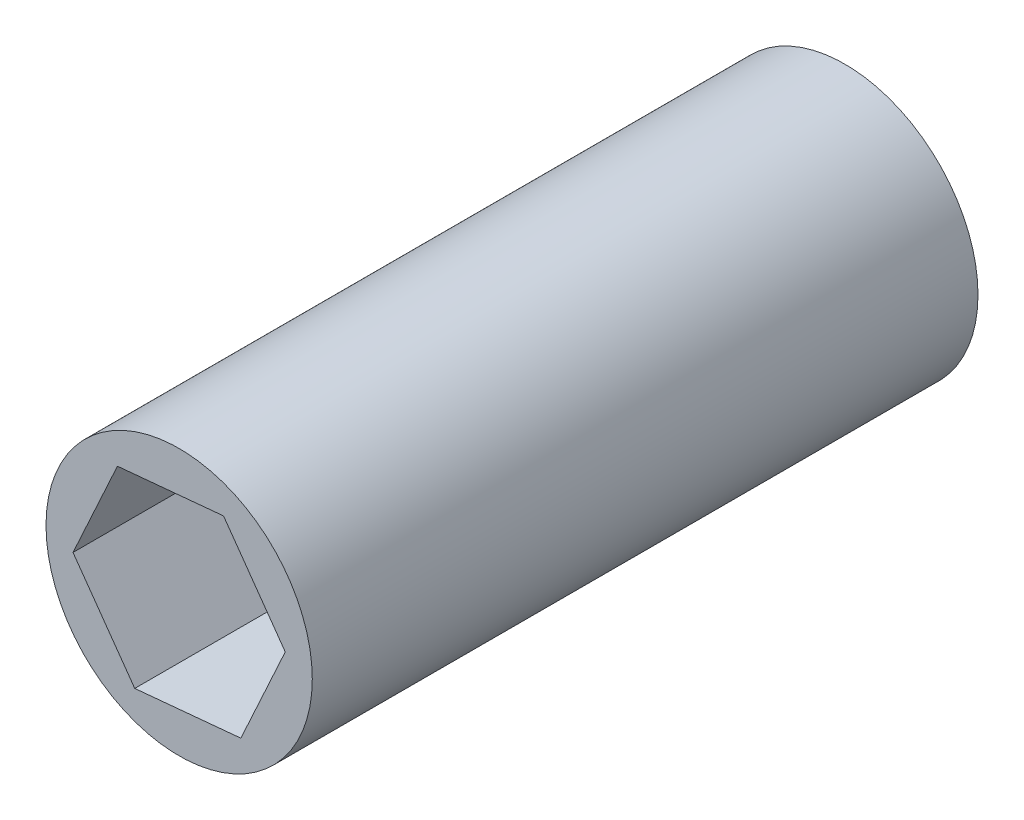
ISO-10303-21;
HEADER;
FILE_DESCRIPTION(('STEP AP214'),'2;1');
FILE_NAME('part.step','',(''),(''),'','','');
FILE_SCHEMA(('AUTOMOTIVE_DESIGN { 1 0 10303 214 1 1 1 1 }'));
ENDSEC;
DATA;
#1=APPLICATION_CONTEXT('core data for automotive mechanical design processes');
#2=APPLICATION_PROTOCOL_DEFINITION('international standard','automotive_design',2000,#1);
#3=PRODUCT_CONTEXT('',#1,'mechanical');
#4=PRODUCT('Part','Part','',(#3));
#5=PRODUCT_RELATED_PRODUCT_CATEGORY('part','',(#4));
#6=PRODUCT_DEFINITION_FORMATION('','',#4);
#7=PRODUCT_DEFINITION_CONTEXT('part definition',#1,'design');
#8=PRODUCT_DEFINITION('design','',#6,#7);
#9=PRODUCT_DEFINITION_SHAPE('','',#8);
#10=(LENGTH_UNIT() NAMED_UNIT(*) SI_UNIT(.MILLI.,.METRE.));
#11=(NAMED_UNIT(*) PLANE_ANGLE_UNIT() SI_UNIT($,.RADIAN.));
#12=(NAMED_UNIT(*) SI_UNIT($,.STERADIAN.) SOLID_ANGLE_UNIT());
#13=UNCERTAINTY_MEASURE_WITH_UNIT(LENGTH_MEASURE(1.E-05),#10,'distance_accuracy_value','');
#14=(GEOMETRIC_REPRESENTATION_CONTEXT(3) GLOBAL_UNCERTAINTY_ASSIGNED_CONTEXT((#13)) GLOBAL_UNIT_ASSIGNED_CONTEXT((#10,
#11,#12)) REPRESENTATION_CONTEXT('',''));
#15=CARTESIAN_POINT('',(0.,0.,0.));
#16=DIRECTION('',(0.,0.,1.));
#17=DIRECTION('',(1.,0.,0.));
#18=AXIS2_PLACEMENT_3D('',#15,#16,#17);
#19=CARTESIAN_POINT('',(0.,0.,47.625));
#20=DIRECTION('',(0.,0.,1.));
#21=DIRECTION('',(1.,0.,0.));
#22=AXIS2_PLACEMENT_3D('',#19,#20,#21);
#23=PLANE('',#22);
#24=CARTESIAN_POINT('',(0.,0.,47.625));
#25=DIRECTION('',(0.,0.,1.));
#26=DIRECTION('',(1.,0.,0.));
#27=AXIS2_PLACEMENT_3D('',#24,#25,#26);
#28=CIRCLE('',#27,9.525);
#29=CARTESIAN_POINT('',(9.525,0.,47.625));
#30=VERTEX_POINT('',#29);
#31=EDGE_CURVE('E11',#30,#30,#28,.T.);
#32=ORIENTED_EDGE('',*,*,#31,.T.);
#33=EDGE_LOOP('',(#32));
#34=FACE_BOUND('',#33,.T.);
#35=DIRECTION('',(-0.416593831263026,-0.90909272340812,0.));
#36=VECTOR('',#35,1.);
#37=CARTESIAN_POINT('',(-4.41525056303659,6.2173936499902,47.625));
#38=LINE('',#37,#36);
#39=CARTESIAN_POINT('',(-4.41525056303659,6.2173936499902,47.625));
#40=VERTEX_POINT('',#39);
#41=CARTESIAN_POINT('',(-7.59204612773786,-0.715022326668139,47.625));
#42=VERTEX_POINT('',#41);
#43=EDGE_CURVE('E94',#40,#42,#38,.T.);
#44=ORIENTED_EDGE('',*,*,#43,.F.);
#45=DIRECTION('',(-0.995594308498526,-0.0937655207703908,0.));
#46=VECTOR('',#45,1.);
#47=CARTESIAN_POINT('',(3.17679556470127,6.93241597665833,47.625));
#48=LINE('',#47,#46);
#49=CARTESIAN_POINT('',(3.17679556470127,6.93241597665833,47.625));
#50=VERTEX_POINT('',#49);
#51=EDGE_CURVE('E86',#50,#40,#48,.T.);
#52=ORIENTED_EDGE('',*,*,#51,.F.);
#53=DIRECTION('',(-0.579000477235499,0.815327202637729,0.));
#54=VECTOR('',#53,1.);
#55=CARTESIAN_POINT('',(7.59204612773786,0.715022326668137,47.625));
#56=LINE('',#55,#54);
#57=CARTESIAN_POINT('',(7.59204612773786,0.715022326668137,47.625));
#58=VERTEX_POINT('',#57);
#59=EDGE_CURVE('E114',#58,#50,#56,.T.);
#60=ORIENTED_EDGE('',*,*,#59,.F.);
#61=DIRECTION('',(0.416593831263027,0.90909272340812,0.));
#62=VECTOR('',#61,1.);
#63=CARTESIAN_POINT('',(4.41525056303659,-6.2173936499902,47.625));
#64=LINE('',#63,#62);
#65=CARTESIAN_POINT('',(4.41525056303659,-6.2173936499902,47.625));
#66=VERTEX_POINT('',#65);
#67=EDGE_CURVE('E112',#66,#58,#64,.T.);
#68=ORIENTED_EDGE('',*,*,#67,.F.);
#69=DIRECTION('',(0.995594308498526,0.0937655207703907,0.));
#70=VECTOR('',#69,1.);
#71=CARTESIAN_POINT('',(-3.17679556470126,-6.93241597665833,47.625));
#72=LINE('',#71,#70);
#73=CARTESIAN_POINT('',(-3.17679556470126,-6.93241597665833,47.625));
#74=VERTEX_POINT('',#73);
#75=EDGE_CURVE('E108',#74,#66,#72,.T.);
#76=ORIENTED_EDGE('',*,*,#75,.F.);
#77=DIRECTION('',(0.579000477235499,-0.815327202637729,0.));
#78=VECTOR('',#77,1.);
#79=CARTESIAN_POINT('',(-7.59204612773786,-0.715022326668139,47.625));
#80=LINE('',#79,#78);
#81=EDGE_CURVE('E106',#42,#74,#80,.T.);
#82=ORIENTED_EDGE('',*,*,#81,.F.);
#83=EDGE_LOOP('',(#44,#52,#60,#68,#76,#82));
#84=FACE_BOUND('',#83,.T.);
#85=ADVANCED_FACE('F33',(#34,#84),#23,.T.);
#86=CARTESIAN_POINT('',(0.,0.,0.));
#87=DIRECTION('',(0.,0.,1.));
#88=DIRECTION('',(1.,0.,0.));
#89=AXIS2_PLACEMENT_3D('',#86,#87,#88);
#90=PLANE('',#89);
#91=CARTESIAN_POINT('',(0.,0.,0.));
#92=DIRECTION('',(0.,0.,1.));
#93=DIRECTION('',(1.,0.,0.));
#94=AXIS2_PLACEMENT_3D('',#91,#92,#93);
#95=CIRCLE('',#94,9.525);
#96=CARTESIAN_POINT('',(9.525,0.,0.));
#97=VERTEX_POINT('',#96);
#98=EDGE_CURVE('E37',#97,#97,#95,.T.);
#99=ORIENTED_EDGE('',*,*,#98,.F.);
#100=EDGE_LOOP('',(#99));
#101=FACE_BOUND('',#100,.T.);
#102=DIRECTION('',(-0.995594308498526,-0.0937655207703908,0.));
#103=VECTOR('',#102,1.);
#104=CARTESIAN_POINT('',(3.17679556470127,6.93241597665833,0.));
#105=LINE('',#104,#103);
#106=CARTESIAN_POINT('',(3.17679556470127,6.93241597665833,0.));
#107=VERTEX_POINT('',#106);
#108=CARTESIAN_POINT('',(-4.41525056303659,6.2173936499902,0.));
#109=VERTEX_POINT('',#108);
#110=EDGE_CURVE('E56',#107,#109,#105,.T.);
#111=ORIENTED_EDGE('',*,*,#110,.T.);
#112=DIRECTION('',(-0.416593831263026,-0.90909272340812,0.));
#113=VECTOR('',#112,1.);
#114=CARTESIAN_POINT('',(-4.41525056303659,6.2173936499902,0.));
#115=LINE('',#114,#113);
#116=CARTESIAN_POINT('',(-7.59204612773786,-0.715022326668139,0.));
#117=VERTEX_POINT('',#116);
#118=EDGE_CURVE('E101',#109,#117,#115,.T.);
#119=ORIENTED_EDGE('',*,*,#118,.T.);
#120=DIRECTION('',(0.579000477235499,-0.815327202637729,0.));
#121=VECTOR('',#120,1.);
#122=CARTESIAN_POINT('',(-7.59204612773786,-0.715022326668139,0.));
#123=LINE('',#122,#121);
#124=CARTESIAN_POINT('',(-3.17679556470126,-6.93241597665833,0.));
#125=VERTEX_POINT('',#124);
#126=EDGE_CURVE('E118',#117,#125,#123,.T.);
#127=ORIENTED_EDGE('',*,*,#126,.T.);
#128=DIRECTION('',(0.995594308498526,0.0937655207703907,0.));
#129=VECTOR('',#128,1.);
#130=CARTESIAN_POINT('',(-3.17679556470126,-6.93241597665833,0.));
#131=LINE('',#130,#129);
#132=CARTESIAN_POINT('',(4.41525056303659,-6.2173936499902,0.));
#133=VERTEX_POINT('',#132);
#134=EDGE_CURVE('E121',#125,#133,#131,.T.);
#135=ORIENTED_EDGE('',*,*,#134,.T.);
#136=DIRECTION('',(0.416593831263027,0.90909272340812,0.));
#137=VECTOR('',#136,1.);
#138=CARTESIAN_POINT('',(4.41525056303659,-6.2173936499902,0.));
#139=LINE('',#138,#137);
#140=CARTESIAN_POINT('',(7.59204612773786,0.715022326668137,0.));
#141=VERTEX_POINT('',#140);
#142=EDGE_CURVE('E124',#133,#141,#139,.T.);
#143=ORIENTED_EDGE('',*,*,#142,.T.);
#144=DIRECTION('',(-0.579000477235499,0.815327202637729,0.));
#145=VECTOR('',#144,1.);
#146=CARTESIAN_POINT('',(7.59204612773786,0.715022326668137,0.));
#147=LINE('',#146,#145);
#148=EDGE_CURVE('E95',#141,#107,#147,.T.);
#149=ORIENTED_EDGE('',*,*,#148,.T.);
#150=EDGE_LOOP('',(#111,#119,#127,#135,#143,#149));
#151=FACE_BOUND('',#150,.T.);
#152=ADVANCED_FACE('F141',(#101,#151),#90,.F.);
#153=CARTESIAN_POINT('',(0.,0.,47.625));
#154=DIRECTION('',(0.,0.,-1.));
#155=DIRECTION('',(-1.,0.,0.));
#156=AXIS2_PLACEMENT_3D('',#153,#154,#155);
#157=CYLINDRICAL_SURFACE('',#156,9.525);
#158=ORIENTED_EDGE('',*,*,#31,.F.);
#159=EDGE_LOOP('',(#158));
#160=FACE_BOUND('',#159,.T.);
#161=ORIENTED_EDGE('',*,*,#98,.T.);
#162=EDGE_LOOP('',(#161));
#163=FACE_BOUND('',#162,.T.);
#164=ADVANCED_FACE('F35',(#160,#163),#157,.T.);
#165=CARTESIAN_POINT('',(3.17679556470127,6.93241597665833,47.625));
#166=DIRECTION('',(0.0937655207703908,-0.995594308498526,0.));
#167=DIRECTION('',(0.995594308498526,0.0937655207703908,0.));
#168=AXIS2_PLACEMENT_3D('',#165,#166,#167);
#169=PLANE('',#168);
#170=ORIENTED_EDGE('',*,*,#110,.F.);
#171=DIRECTION('',(0.,0.,-1.));
#172=VECTOR('',#171,1.);
#173=CARTESIAN_POINT('',(3.17679556470127,6.93241597665833,47.625));
#174=LINE('',#173,#172);
#175=EDGE_CURVE('E90',#50,#107,#174,.T.);
#176=ORIENTED_EDGE('',*,*,#175,.F.);
#177=ORIENTED_EDGE('',*,*,#51,.T.);
#178=DIRECTION('',(0.,0.,-1.));
#179=VECTOR('',#178,1.);
#180=CARTESIAN_POINT('',(-4.41525056303659,6.2173936499902,47.625));
#181=LINE('',#180,#179);
#182=EDGE_CURVE('E89',#40,#109,#181,.T.);
#183=ORIENTED_EDGE('',*,*,#182,.T.);
#184=EDGE_LOOP('',(#170,#176,#177,#183));
#185=FACE_BOUND('',#184,.T.);
#186=ADVANCED_FACE('F88',(#185),#169,.T.);
#187=CARTESIAN_POINT('',(-4.41525056303659,6.2173936499902,47.625));
#188=DIRECTION('',(0.90909272340812,-0.416593831263026,0.));
#189=DIRECTION('',(0.416593831263026,0.909092723408121,0.));
#190=AXIS2_PLACEMENT_3D('',#187,#188,#189);
#191=PLANE('',#190);
#192=ORIENTED_EDGE('',*,*,#118,.F.);
#193=ORIENTED_EDGE('',*,*,#182,.F.);
#194=ORIENTED_EDGE('',*,*,#43,.T.);
#195=DIRECTION('',(0.,0.,-1.));
#196=VECTOR('',#195,1.);
#197=CARTESIAN_POINT('',(-7.59204612773786,-0.715022326668139,47.625));
#198=LINE('',#197,#196);
#199=EDGE_CURVE('E102',#42,#117,#198,.T.);
#200=ORIENTED_EDGE('',*,*,#199,.T.);
#201=EDGE_LOOP('',(#192,#193,#194,#200));
#202=FACE_BOUND('',#201,.T.);
#203=ADVANCED_FACE('F98',(#202),#191,.T.);
#204=CARTESIAN_POINT('',(-7.59204612773786,-0.715022326668139,47.625));
#205=DIRECTION('',(0.815327202637729,0.579000477235499,0.));
#206=DIRECTION('',(-0.579000477235499,0.815327202637729,0.));
#207=AXIS2_PLACEMENT_3D('',#204,#205,#206);
#208=PLANE('',#207);
#209=ORIENTED_EDGE('',*,*,#126,.F.);
#210=ORIENTED_EDGE('',*,*,#199,.F.);
#211=ORIENTED_EDGE('',*,*,#81,.T.);
#212=DIRECTION('',(0.,0.,-1.));
#213=VECTOR('',#212,1.);
#214=CARTESIAN_POINT('',(-3.17679556470126,-6.93241597665833,47.625));
#215=LINE('',#214,#213);
#216=EDGE_CURVE('E133',#74,#125,#215,.T.);
#217=ORIENTED_EDGE('',*,*,#216,.T.);
#218=EDGE_LOOP('',(#209,#210,#211,#217));
#219=FACE_BOUND('',#218,.T.);
#220=ADVANCED_FACE('F137',(#219),#208,.T.);
#221=CARTESIAN_POINT('',(-3.17679556470126,-6.93241597665833,47.625));
#222=DIRECTION('',(-0.0937655207703907,0.995594308498526,0.));
#223=DIRECTION('',(-0.995594308498526,-0.0937655207703907,0.));
#224=AXIS2_PLACEMENT_3D('',#221,#222,#223);
#225=PLANE('',#224);
#226=ORIENTED_EDGE('',*,*,#134,.F.);
#227=ORIENTED_EDGE('',*,*,#216,.F.);
#228=ORIENTED_EDGE('',*,*,#75,.T.);
#229=DIRECTION('',(0.,0.,-1.));
#230=VECTOR('',#229,1.);
#231=CARTESIAN_POINT('',(4.41525056303659,-6.2173936499902,47.625));
#232=LINE('',#231,#230);
#233=EDGE_CURVE('E131',#66,#133,#232,.T.);
#234=ORIENTED_EDGE('',*,*,#233,.T.);
#235=EDGE_LOOP('',(#226,#227,#228,#234));
#236=FACE_BOUND('',#235,.T.);
#237=ADVANCED_FACE('F149',(#236),#225,.T.);
#238=CARTESIAN_POINT('',(4.41525056303659,-6.2173936499902,47.625));
#239=DIRECTION('',(-0.90909272340812,0.416593831263027,0.));
#240=DIRECTION('',(-0.416593831263027,-0.90909272340812,0.));
#241=AXIS2_PLACEMENT_3D('',#238,#239,#240);
#242=PLANE('',#241);
#243=ORIENTED_EDGE('',*,*,#142,.F.);
#244=ORIENTED_EDGE('',*,*,#233,.F.);
#245=ORIENTED_EDGE('',*,*,#67,.T.);
#246=DIRECTION('',(0.,0.,-1.));
#247=VECTOR('',#246,1.);
#248=CARTESIAN_POINT('',(7.59204612773786,0.715022326668137,47.625));
#249=LINE('',#248,#247);
#250=EDGE_CURVE('E48',#58,#141,#249,.T.);
#251=ORIENTED_EDGE('',*,*,#250,.T.);
#252=EDGE_LOOP('',(#243,#244,#245,#251));
#253=FACE_BOUND('',#252,.T.);
#254=ADVANCED_FACE('F147',(#253),#242,.T.);
#255=CARTESIAN_POINT('',(7.59204612773786,0.715022326668137,47.625));
#256=DIRECTION('',(-0.815327202637729,-0.579000477235499,0.));
#257=DIRECTION('',(0.579000477235499,-0.815327202637729,0.));
#258=AXIS2_PLACEMENT_3D('',#255,#256,#257);
#259=PLANE('',#258);
#260=ORIENTED_EDGE('',*,*,#148,.F.);
#261=ORIENTED_EDGE('',*,*,#250,.F.);
#262=ORIENTED_EDGE('',*,*,#59,.T.);
#263=ORIENTED_EDGE('',*,*,#175,.T.);
#264=EDGE_LOOP('',(#260,#261,#262,#263));
#265=FACE_BOUND('',#264,.T.);
#266=ADVANCED_FACE('F143',(#265),#259,.T.);
#267=CLOSED_SHELL('',(#85,#152,#164,#186,#203,#220,#237,#254,#266));
#268=MANIFOLD_SOLID_BREP('B2',#267);
#269=ADVANCED_BREP_SHAPE_REPRESENTATION('',(#18,#268),#14);
#270=SHAPE_DEFINITION_REPRESENTATION(#9,#269);
ENDSEC;
END-ISO-10303-21;
